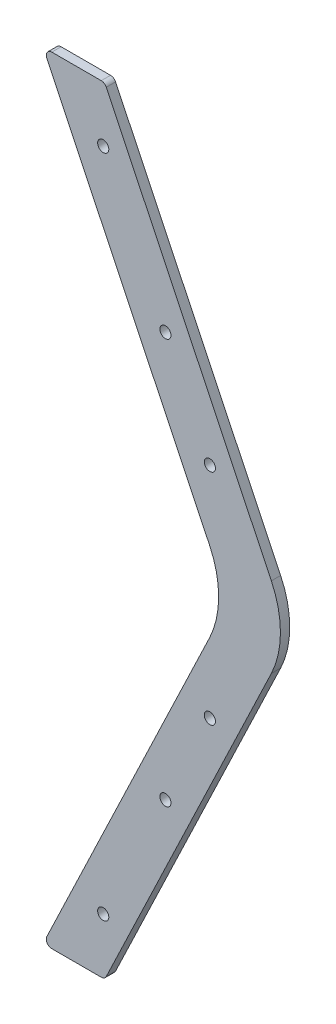
ISO-10303-21;
HEADER;
FILE_DESCRIPTION(('STEP AP214'),'2;1');
FILE_NAME('part.step','',(''),(''),'','','');
FILE_SCHEMA(('AUTOMOTIVE_DESIGN { 1 0 10303 214 1 1 1 1 }'));
ENDSEC;
DATA;
#1=APPLICATION_CONTEXT('core data for automotive mechanical design processes');
#2=APPLICATION_PROTOCOL_DEFINITION('international standard','automotive_design',2000,#1);
#3=PRODUCT_CONTEXT('',#1,'mechanical');
#4=PRODUCT('Part','Part','',(#3));
#5=PRODUCT_RELATED_PRODUCT_CATEGORY('part','',(#4));
#6=PRODUCT_DEFINITION_FORMATION('','',#4);
#7=PRODUCT_DEFINITION_CONTEXT('part definition',#1,'design');
#8=PRODUCT_DEFINITION('design','',#6,#7);
#9=PRODUCT_DEFINITION_SHAPE('','',#8);
#10=(LENGTH_UNIT() NAMED_UNIT(*) SI_UNIT(.MILLI.,.METRE.));
#11=(NAMED_UNIT(*) PLANE_ANGLE_UNIT() SI_UNIT($,.RADIAN.));
#12=(NAMED_UNIT(*) SI_UNIT($,.STERADIAN.) SOLID_ANGLE_UNIT());
#13=UNCERTAINTY_MEASURE_WITH_UNIT(LENGTH_MEASURE(1.E-05),#10,'distance_accuracy_value','');
#14=(GEOMETRIC_REPRESENTATION_CONTEXT(3) GLOBAL_UNCERTAINTY_ASSIGNED_CONTEXT((#13)) GLOBAL_UNIT_ASSIGNED_CONTEXT((#10,
#11,#12)) REPRESENTATION_CONTEXT('',''));
#15=CARTESIAN_POINT('',(0.,0.,0.));
#16=DIRECTION('',(0.,0.,1.));
#17=DIRECTION('',(1.,0.,0.));
#18=AXIS2_PLACEMENT_3D('',#15,#16,#17);
#19=CARTESIAN_POINT('',(0.,-209.,5.));
#20=DIRECTION('',(0.,1.,0.));
#21=DIRECTION('',(-1.,0.,0.));
#22=AXIS2_PLACEMENT_3D('',#19,#20,#21);
#23=PLANE('',#22);
#24=DIRECTION('',(1.,0.,0.));
#25=VECTOR('',#24,1.);
#26=CARTESIAN_POINT('',(0.,-209.,0.));
#27=LINE('',#26,#25);
#28=CARTESIAN_POINT('',(4.76112352209064,-209.,0.));
#29=VERTEX_POINT('',#28);
#30=CARTESIAN_POINT('',(31.3668581102988,-209.,0.));
#31=VERTEX_POINT('',#30);
#32=EDGE_CURVE('E228',#29,#31,#27,.T.);
#33=ORIENTED_EDGE('',*,*,#32,.T.);
#34=DIRECTION('',(0.,0.,-1.));
#35=VECTOR('',#34,1.);
#36=CARTESIAN_POINT('',(31.3668581102988,-209.,5.));
#37=LINE('',#36,#35);
#38=CARTESIAN_POINT('',(31.3668581102988,-209.,5.));
#39=VERTEX_POINT('',#38);
#40=EDGE_CURVE('E189',#31,#39,#37,.F.);
#41=ORIENTED_EDGE('',*,*,#40,.T.);
#42=DIRECTION('',(1.,0.,0.));
#43=VECTOR('',#42,1.);
#44=CARTESIAN_POINT('',(0.,-209.,5.));
#45=LINE('',#44,#43);
#46=CARTESIAN_POINT('',(4.76112352209064,-209.,5.));
#47=VERTEX_POINT('',#46);
#48=EDGE_CURVE('E166',#47,#39,#45,.T.);
#49=ORIENTED_EDGE('',*,*,#48,.F.);
#50=DIRECTION('',(0.,0.,-1.));
#51=VECTOR('',#50,1.);
#52=CARTESIAN_POINT('',(4.76112352209064,-209.,5.));
#53=LINE('',#52,#51);
#54=EDGE_CURVE('E186',#47,#29,#53,.T.);
#55=ORIENTED_EDGE('',*,*,#54,.T.);
#56=EDGE_LOOP('',(#33,#41,#49,#55));
#57=FACE_BOUND('',#56,.T.);
#58=ADVANCED_FACE('F39',(#57),#23,.F.);
#59=CARTESIAN_POINT('',(133.25716823526,0.,5.));
#60=DIRECTION('',(-0.902061167318299,0.431608214027894,0.));
#61=DIRECTION('',(-0.431608214027894,-0.902061167318299,0.));
#62=AXIS2_PLACEMENT_3D('',#59,#60,#61);
#63=PLANE('',#62);
#64=DIRECTION('',(0.431608214027894,0.902061167318299,0.));
#65=VECTOR('',#64,1.);
#66=CARTESIAN_POINT('',(133.25716823526,0.,0.));
#67=LINE('',#66,#65);
#68=CARTESIAN_POINT('',(34.0730416122537,-207.294824642084,0.));
#69=VERTEX_POINT('',#68);
#70=CARTESIAN_POINT('',(122.931612875741,-21.5804107013947,0.));
#71=VERTEX_POINT('',#70);
#72=EDGE_CURVE('E161',#69,#71,#67,.T.);
#73=ORIENTED_EDGE('',*,*,#72,.T.);
#74=DIRECTION('',(0.,0.,-1.));
#75=VECTOR('',#74,1.);
#76=CARTESIAN_POINT('',(122.931612875741,-21.5804107013947,5.));
#77=LINE('',#76,#75);
#78=CARTESIAN_POINT('',(122.931612875741,-21.5804107013947,5.));
#79=VERTEX_POINT('',#78);
#80=EDGE_CURVE('E202',#71,#79,#77,.F.);
#81=ORIENTED_EDGE('',*,*,#80,.T.);
#82=DIRECTION('',(0.431608214027894,0.902061167318299,0.));
#83=VECTOR('',#82,1.);
#84=CARTESIAN_POINT('',(133.25716823526,0.,5.));
#85=LINE('',#84,#83);
#86=CARTESIAN_POINT('',(34.0730416122537,-207.294824642084,5.));
#87=VERTEX_POINT('',#86);
#88=EDGE_CURVE('E244',#87,#79,#85,.T.);
#89=ORIENTED_EDGE('',*,*,#88,.F.);
#90=DIRECTION('',(0.,0.,-1.));
#91=VECTOR('',#90,1.);
#92=CARTESIAN_POINT('',(34.0730416122537,-207.294824642084,5.));
#93=LINE('',#92,#91);
#94=EDGE_CURVE('E183',#87,#69,#93,.T.);
#95=ORIENTED_EDGE('',*,*,#94,.T.);
#96=EDGE_LOOP('',(#73,#81,#89,#95));
#97=FACE_BOUND('',#96,.T.);
#98=ADVANCED_FACE('F296',(#97),#63,.F.);
#99=CARTESIAN_POINT('',(33.2571682352602,209.,5.));
#100=DIRECTION('',(-0.902061167318298,-0.431608214027895,0.));
#101=DIRECTION('',(0.431608214027895,-0.902061167318298,0.));
#102=AXIS2_PLACEMENT_3D('',#99,#100,#101);
#103=PLANE('',#102);
#104=DIRECTION('',(-0.431608214027895,0.902061167318298,0.));
#105=VECTOR('',#104,1.);
#106=CARTESIAN_POINT('',(33.2571682352602,209.,5.));
#107=LINE('',#106,#105);
#108=CARTESIAN_POINT('',(122.931612875741,21.5804107013948,5.));
#109=VERTEX_POINT('',#108);
#110=CARTESIAN_POINT('',(34.0730416122537,207.294824642084,5.));
#111=VERTEX_POINT('',#110);
#112=EDGE_CURVE('E242',#109,#111,#107,.T.);
#113=ORIENTED_EDGE('',*,*,#112,.F.);
#114=DIRECTION('',(0.,0.,-1.));
#115=VECTOR('',#114,1.);
#116=CARTESIAN_POINT('',(122.931612875741,21.5804107013947,5.));
#117=LINE('',#116,#115);
#118=CARTESIAN_POINT('',(122.931612875741,21.5804107013948,0.));
#119=VERTEX_POINT('',#118);
#120=EDGE_CURVE('E197',#109,#119,#117,.T.);
#121=ORIENTED_EDGE('',*,*,#120,.T.);
#122=DIRECTION('',(-0.431608214027895,0.902061167318298,0.));
#123=VECTOR('',#122,1.);
#124=CARTESIAN_POINT('',(33.2571682352602,209.,0.));
#125=LINE('',#124,#123);
#126=CARTESIAN_POINT('',(34.0730416122537,207.294824642084,0.));
#127=VERTEX_POINT('',#126);
#128=EDGE_CURVE('E157',#119,#127,#125,.T.);
#129=ORIENTED_EDGE('',*,*,#128,.T.);
#130=DIRECTION('',(0.,0.,-1.));
#131=VECTOR('',#130,1.);
#132=CARTESIAN_POINT('',(34.0730416122537,207.294824642084,5.));
#133=LINE('',#132,#131);
#134=EDGE_CURVE('E137',#127,#111,#133,.F.);
#135=ORIENTED_EDGE('',*,*,#134,.T.);
#136=EDGE_LOOP('',(#113,#121,#129,#135));
#137=FACE_BOUND('',#136,.T.);
#138=ADVANCED_FACE('F294',(#137),#103,.F.);
#139=CARTESIAN_POINT('',(0.,209.,5.));
#140=DIRECTION('',(0.,-1.,0.));
#141=DIRECTION('',(1.,0.,0.));
#142=AXIS2_PLACEMENT_3D('',#139,#140,#141);
#143=PLANE('',#142);
#144=DIRECTION('',(-1.,0.,0.));
#145=VECTOR('',#144,1.);
#146=CARTESIAN_POINT('',(0.,209.,5.));
#147=LINE('',#146,#145);
#148=CARTESIAN_POINT('',(31.3668581102988,209.,5.));
#149=VERTEX_POINT('',#148);
#150=CARTESIAN_POINT('',(4.76112352209056,209.,5.));
#151=VERTEX_POINT('',#150);
#152=EDGE_CURVE('E150',#149,#151,#147,.T.);
#153=ORIENTED_EDGE('',*,*,#152,.F.);
#154=DIRECTION('',(0.,0.,-1.));
#155=VECTOR('',#154,1.);
#156=CARTESIAN_POINT('',(31.3668581102988,209.,5.));
#157=LINE('',#156,#155);
#158=CARTESIAN_POINT('',(31.3668581102988,209.,0.));
#159=VERTEX_POINT('',#158);
#160=EDGE_CURVE('E135',#149,#159,#157,.T.);
#161=ORIENTED_EDGE('',*,*,#160,.T.);
#162=DIRECTION('',(-1.,0.,0.));
#163=VECTOR('',#162,1.);
#164=CARTESIAN_POINT('',(0.,209.,0.));
#165=LINE('',#164,#163);
#166=CARTESIAN_POINT('',(4.76112352209056,209.,0.));
#167=VERTEX_POINT('',#166);
#168=EDGE_CURVE('E147',#159,#167,#165,.T.);
#169=ORIENTED_EDGE('',*,*,#168,.T.);
#170=DIRECTION('',(0.,0.,-1.));
#171=VECTOR('',#170,1.);
#172=CARTESIAN_POINT('',(4.76112352209056,209.,5.));
#173=LINE('',#172,#171);
#174=EDGE_CURVE('E152',#167,#151,#173,.F.);
#175=ORIENTED_EDGE('',*,*,#174,.T.);
#176=EDGE_LOOP('',(#153,#161,#169,#175));
#177=FACE_BOUND('',#176,.T.);
#178=ADVANCED_FACE('F146',(#177),#143,.F.);
#179=CARTESIAN_POINT('',(0.,209.,5.));
#180=DIRECTION('',(0.902061167318298,0.431608214027894,0.));
#181=DIRECTION('',(-0.431608214027894,0.902061167318298,0.));
#182=AXIS2_PLACEMENT_3D('',#179,#180,#181);
#183=PLANE('',#182);
#184=DIRECTION('',(0.431608214027894,-0.902061167318298,0.));
#185=VECTOR('',#184,1.);
#186=CARTESIAN_POINT('',(0.,209.,0.));
#187=LINE('',#186,#185);
#188=CARTESIAN_POINT('',(2.05494002013566,204.705175357916,0.));
#189=VERTEX_POINT('',#188);
#190=CARTESIAN_POINT('',(89.674444640481,21.5804107013948,0.));
#191=VERTEX_POINT('',#190);
#192=EDGE_CURVE('E156',#189,#191,#187,.T.);
#193=ORIENTED_EDGE('',*,*,#192,.T.);
#194=DIRECTION('',(0.,0.,-1.));
#195=VECTOR('',#194,1.);
#196=CARTESIAN_POINT('',(89.674444640481,21.5804107013947,5.));
#197=LINE('',#196,#195);
#198=CARTESIAN_POINT('',(89.674444640481,21.5804107013948,5.));
#199=VERTEX_POINT('',#198);
#200=EDGE_CURVE('E62',#191,#199,#197,.F.);
#201=ORIENTED_EDGE('',*,*,#200,.T.);
#202=DIRECTION('',(0.431608214027894,-0.902061167318298,0.));
#203=VECTOR('',#202,1.);
#204=CARTESIAN_POINT('',(0.,209.,5.));
#205=LINE('',#204,#203);
#206=CARTESIAN_POINT('',(2.05494002013566,204.705175357916,5.));
#207=VERTEX_POINT('',#206);
#208=EDGE_CURVE('E239',#207,#199,#205,.T.);
#209=ORIENTED_EDGE('',*,*,#208,.F.);
#210=DIRECTION('',(0.,0.,-1.));
#211=VECTOR('',#210,1.);
#212=CARTESIAN_POINT('',(2.05494002013566,204.705175357916,5.));
#213=LINE('',#212,#211);
#214=EDGE_CURVE('E194',#207,#189,#213,.T.);
#215=ORIENTED_EDGE('',*,*,#214,.T.);
#216=EDGE_LOOP('',(#193,#201,#209,#215));
#217=FACE_BOUND('',#216,.T.);
#218=ADVANCED_FACE('F308',(#217),#183,.F.);
#219=CARTESIAN_POINT('',(100.,0.,5.));
#220=DIRECTION('',(0.902061167318299,-0.431608214027894,0.));
#221=DIRECTION('',(0.431608214027894,0.902061167318299,0.));
#222=AXIS2_PLACEMENT_3D('',#219,#220,#221);
#223=PLANE('',#222);
#224=DIRECTION('',(-0.431608214027894,-0.902061167318299,0.));
#225=VECTOR('',#224,1.);
#226=CARTESIAN_POINT('',(100.,0.,5.));
#227=LINE('',#226,#225);
#228=CARTESIAN_POINT('',(89.674444640481,-21.5804107013947,5.));
#229=VERTEX_POINT('',#228);
#230=CARTESIAN_POINT('',(2.05494002013573,-204.705175357916,5.));
#231=VERTEX_POINT('',#230);
#232=EDGE_CURVE('E167',#229,#231,#227,.T.);
#233=ORIENTED_EDGE('',*,*,#232,.F.);
#234=DIRECTION('',(0.,0.,-1.));
#235=VECTOR('',#234,1.);
#236=CARTESIAN_POINT('',(89.674444640481,-21.5804107013947,0.));
#237=LINE('',#236,#235);
#238=CARTESIAN_POINT('',(89.674444640481,-21.5804107013947,0.));
#239=VERTEX_POINT('',#238);
#240=EDGE_CURVE('E206',#229,#239,#237,.T.);
#241=ORIENTED_EDGE('',*,*,#240,.T.);
#242=DIRECTION('',(-0.431608214027894,-0.902061167318299,0.));
#243=VECTOR('',#242,1.);
#244=CARTESIAN_POINT('',(100.,0.,0.));
#245=LINE('',#244,#243);
#246=CARTESIAN_POINT('',(2.05494002013573,-204.705175357916,0.));
#247=VERTEX_POINT('',#246);
#248=EDGE_CURVE('E159',#239,#247,#245,.T.);
#249=ORIENTED_EDGE('',*,*,#248,.T.);
#250=DIRECTION('',(0.,0.,-1.));
#251=VECTOR('',#250,1.);
#252=CARTESIAN_POINT('',(2.05494002013573,-204.705175357916,5.));
#253=LINE('',#252,#251);
#254=EDGE_CURVE('E191',#247,#231,#253,.F.);
#255=ORIENTED_EDGE('',*,*,#254,.T.);
#256=EDGE_LOOP('',(#233,#241,#249,#255));
#257=FACE_BOUND('',#256,.T.);
#258=ADVANCED_FACE('F272',(#257),#223,.F.);
#259=CARTESIAN_POINT('',(0.,0.,5.));
#260=DIRECTION('',(0.,0.,-1.));
#261=DIRECTION('',(-1.,0.,0.));
#262=AXIS2_PLACEMENT_3D('',#259,#260,#261);
#263=PLANE('',#262);
#264=CARTESIAN_POINT('',(32.4180578018406,179.,5.));
#265=DIRECTION('',(0.,0.,1.));
#266=DIRECTION('',(1.,0.,0.));
#267=AXIS2_PLACEMENT_3D('',#264,#265,#266);
#268=CIRCLE('',#267,3.);
#269=CARTESIAN_POINT('',(35.4180578018406,179.,5.));
#270=VERTEX_POINT('',#269);
#271=EDGE_CURVE('E215',#270,#270,#268,.T.);
#272=ORIENTED_EDGE('',*,*,#271,.F.);
#273=EDGE_LOOP('',(#272));
#274=FACE_BOUND('',#273,.T.);
#275=CARTESIAN_POINT('',(65.9108807683478,109.,5.));
#276=DIRECTION('',(0.,0.,1.));
#277=DIRECTION('',(1.,0.,0.));
#278=AXIS2_PLACEMENT_3D('',#275,#276,#277);
#279=CIRCLE('',#278,3.00000000000001);
#280=CARTESIAN_POINT('',(68.9108807683478,109.,5.));
#281=VERTEX_POINT('',#280);
#282=EDGE_CURVE('E261',#281,#281,#279,.T.);
#283=ORIENTED_EDGE('',*,*,#282,.F.);
#284=EDGE_LOOP('',(#283));
#285=FACE_BOUND('',#284,.T.);
#286=CARTESIAN_POINT('',(89.8343257444244,59.,5.));
#287=DIRECTION('',(0.,0.,1.));
#288=DIRECTION('',(1.,0.,0.));
#289=AXIS2_PLACEMENT_3D('',#286,#287,#288);
#290=CIRCLE('',#289,3.00000000000001);
#291=CARTESIAN_POINT('',(92.8343257444244,59.,5.));
#292=VERTEX_POINT('',#291);
#293=EDGE_CURVE('E258',#292,#292,#290,.T.);
#294=ORIENTED_EDGE('',*,*,#293,.F.);
#295=EDGE_LOOP('',(#294));
#296=FACE_BOUND('',#295,.T.);
#297=CARTESIAN_POINT('',(89.8343257444245,-59.,5.));
#298=DIRECTION('',(0.,0.,1.));
#299=DIRECTION('',(1.,0.,0.));
#300=AXIS2_PLACEMENT_3D('',#297,#298,#299);
#301=CIRCLE('',#300,3.00000000000001);
#302=CARTESIAN_POINT('',(92.8343257444245,-59.,5.));
#303=VERTEX_POINT('',#302);
#304=EDGE_CURVE('E255',#303,#303,#301,.T.);
#305=ORIENTED_EDGE('',*,*,#304,.F.);
#306=EDGE_LOOP('',(#305));
#307=FACE_BOUND('',#306,.T.);
#308=CARTESIAN_POINT('',(65.9108807683479,-109.,5.));
#309=DIRECTION('',(0.,0.,1.));
#310=DIRECTION('',(1.,0.,0.));
#311=AXIS2_PLACEMENT_3D('',#308,#309,#310);
#312=CIRCLE('',#311,3.00000000000002);
#313=CARTESIAN_POINT('',(68.9108807683479,-109.,5.));
#314=VERTEX_POINT('',#313);
#315=EDGE_CURVE('E252',#314,#314,#312,.T.);
#316=ORIENTED_EDGE('',*,*,#315,.F.);
#317=EDGE_LOOP('',(#316));
#318=FACE_BOUND('',#317,.T.);
#319=CARTESIAN_POINT('',(32.4180578018407,-179.,5.));
#320=DIRECTION('',(0.,0.,1.));
#321=DIRECTION('',(1.,0.,0.));
#322=AXIS2_PLACEMENT_3D('',#319,#320,#321);
#323=CIRCLE('',#322,2.99999999999999);
#324=CARTESIAN_POINT('',(35.4180578018407,-179.,5.));
#325=VERTEX_POINT('',#324);
#326=EDGE_CURVE('E249',#325,#325,#323,.T.);
#327=ORIENTED_EDGE('',*,*,#326,.F.);
#328=EDGE_LOOP('',(#327));
#329=FACE_BOUND('',#328,.T.);
#330=ORIENTED_EDGE('',*,*,#88,.T.);
#331=CARTESIAN_POINT('',(77.8285545098264,0.,5.));
#332=DIRECTION('',(0.,0.,-1.));
#333=DIRECTION('',(-1.,0.,0.));
#334=AXIS2_PLACEMENT_3D('',#331,#332,#333);
#335=CIRCLE('',#334,50.);
#336=EDGE_CURVE('E204',#79,#109,#335,.F.);
#337=ORIENTED_EDGE('',*,*,#336,.T.);
#338=ORIENTED_EDGE('',*,*,#112,.T.);
#339=CARTESIAN_POINT('',(31.3668581102988,206.,5.));
#340=DIRECTION('',(0.,0.,-1.));
#341=DIRECTION('',(-1.,0.,0.));
#342=AXIS2_PLACEMENT_3D('',#339,#340,#341);
#343=CIRCLE('',#342,3.);
#344=EDGE_CURVE('E181',#111,#149,#343,.F.);
#345=ORIENTED_EDGE('',*,*,#344,.T.);
#346=ORIENTED_EDGE('',*,*,#152,.T.);
#347=CARTESIAN_POINT('',(4.76112352209056,206.,5.));
#348=DIRECTION('',(0.,0.,-1.));
#349=DIRECTION('',(-1.,0.,0.));
#350=AXIS2_PLACEMENT_3D('',#347,#348,#349);
#351=CIRCLE('',#350,3.);
#352=EDGE_CURVE('E175',#151,#207,#351,.F.);
#353=ORIENTED_EDGE('',*,*,#352,.T.);
#354=ORIENTED_EDGE('',*,*,#208,.T.);
#355=CARTESIAN_POINT('',(44.5713862745661,0.,5.));
#356=DIRECTION('',(0.,0.,-1.));
#357=DIRECTION('',(-1.,0.,0.));
#358=AXIS2_PLACEMENT_3D('',#355,#356,#357);
#359=CIRCLE('',#358,50.);
#360=EDGE_CURVE('E11',#199,#229,#359,.T.);
#361=ORIENTED_EDGE('',*,*,#360,.T.);
#362=ORIENTED_EDGE('',*,*,#232,.T.);
#363=CARTESIAN_POINT('',(4.76112352209064,-206.,5.));
#364=DIRECTION('',(0.,0.,-1.));
#365=DIRECTION('',(-1.,0.,0.));
#366=AXIS2_PLACEMENT_3D('',#363,#364,#365);
#367=CIRCLE('',#366,3.);
#368=EDGE_CURVE('E177',#231,#47,#367,.F.);
#369=ORIENTED_EDGE('',*,*,#368,.T.);
#370=ORIENTED_EDGE('',*,*,#48,.T.);
#371=CARTESIAN_POINT('',(31.3668581102988,-206.,5.));
#372=DIRECTION('',(0.,0.,-1.));
#373=DIRECTION('',(-1.,0.,0.));
#374=AXIS2_PLACEMENT_3D('',#371,#372,#373);
#375=CIRCLE('',#374,3.);
#376=EDGE_CURVE('E179',#39,#87,#375,.F.);
#377=ORIENTED_EDGE('',*,*,#376,.T.);
#378=EDGE_LOOP('',(#330,#337,#338,#345,#346,#353,#354,#361,#362,#369,#370,#377));
#379=FACE_BOUND('',#378,.T.);
#380=ADVANCED_FACE('F269',(#274,#285,#296,#307,#318,#329,#379),#263,.F.);
#381=CARTESIAN_POINT('',(0.,0.,0.));
#382=DIRECTION('',(0.,0.,-1.));
#383=DIRECTION('',(-1.,0.,0.));
#384=AXIS2_PLACEMENT_3D('',#381,#382,#383);
#385=PLANE('',#384);
#386=CARTESIAN_POINT('',(32.4180578018406,179.,0.));
#387=DIRECTION('',(0.,0.,-1.));
#388=DIRECTION('',(-1.,0.,0.));
#389=AXIS2_PLACEMENT_3D('',#386,#387,#388);
#390=CIRCLE('',#389,3.);
#391=CARTESIAN_POINT('',(29.4180578018406,179.,0.));
#392=VERTEX_POINT('',#391);
#393=EDGE_CURVE('E43',#392,#392,#390,.T.);
#394=ORIENTED_EDGE('',*,*,#393,.F.);
#395=EDGE_LOOP('',(#394));
#396=FACE_BOUND('',#395,.T.);
#397=CARTESIAN_POINT('',(65.9108807683478,109.,0.));
#398=DIRECTION('',(0.,0.,-1.));
#399=DIRECTION('',(-1.,0.,0.));
#400=AXIS2_PLACEMENT_3D('',#397,#398,#399);
#401=CIRCLE('',#400,3.00000000000001);
#402=CARTESIAN_POINT('',(62.9108807683478,109.,0.));
#403=VERTEX_POINT('',#402);
#404=EDGE_CURVE('E223',#403,#403,#401,.T.);
#405=ORIENTED_EDGE('',*,*,#404,.F.);
#406=EDGE_LOOP('',(#405));
#407=FACE_BOUND('',#406,.T.);
#408=CARTESIAN_POINT('',(89.8343257444244,59.,0.));
#409=DIRECTION('',(0.,0.,-1.));
#410=DIRECTION('',(-1.,0.,0.));
#411=AXIS2_PLACEMENT_3D('',#408,#409,#410);
#412=CIRCLE('',#411,3.00000000000001);
#413=CARTESIAN_POINT('',(86.8343257444244,59.,0.));
#414=VERTEX_POINT('',#413);
#415=EDGE_CURVE('E221',#414,#414,#412,.T.);
#416=ORIENTED_EDGE('',*,*,#415,.F.);
#417=EDGE_LOOP('',(#416));
#418=FACE_BOUND('',#417,.T.);
#419=CARTESIAN_POINT('',(89.8343257444245,-59.,0.));
#420=DIRECTION('',(0.,0.,-1.));
#421=DIRECTION('',(-1.,0.,0.));
#422=AXIS2_PLACEMENT_3D('',#419,#420,#421);
#423=CIRCLE('',#422,3.00000000000001);
#424=CARTESIAN_POINT('',(86.8343257444245,-59.,0.));
#425=VERTEX_POINT('',#424);
#426=EDGE_CURVE('E218',#425,#425,#423,.T.);
#427=ORIENTED_EDGE('',*,*,#426,.F.);
#428=EDGE_LOOP('',(#427));
#429=FACE_BOUND('',#428,.T.);
#430=CARTESIAN_POINT('',(65.9108807683479,-109.,0.));
#431=DIRECTION('',(0.,0.,-1.));
#432=DIRECTION('',(-1.,0.,0.));
#433=AXIS2_PLACEMENT_3D('',#430,#431,#432);
#434=CIRCLE('',#433,3.00000000000002);
#435=CARTESIAN_POINT('',(62.9108807683479,-109.,0.));
#436=VERTEX_POINT('',#435);
#437=EDGE_CURVE('E214',#436,#436,#434,.T.);
#438=ORIENTED_EDGE('',*,*,#437,.F.);
#439=EDGE_LOOP('',(#438));
#440=FACE_BOUND('',#439,.T.);
#441=CARTESIAN_POINT('',(32.4180578018407,-179.,0.));
#442=DIRECTION('',(0.,0.,-1.));
#443=DIRECTION('',(-1.,0.,0.));
#444=AXIS2_PLACEMENT_3D('',#441,#442,#443);
#445=CIRCLE('',#444,2.99999999999999);
#446=CARTESIAN_POINT('',(29.4180578018407,-179.,0.));
#447=VERTEX_POINT('',#446);
#448=EDGE_CURVE('E211',#447,#447,#445,.T.);
#449=ORIENTED_EDGE('',*,*,#448,.F.);
#450=EDGE_LOOP('',(#449));
#451=FACE_BOUND('',#450,.T.);
#452=ORIENTED_EDGE('',*,*,#128,.F.);
#453=CARTESIAN_POINT('',(77.8285545098264,0.,0.));
#454=DIRECTION('',(0.,0.,-1.));
#455=DIRECTION('',(-1.,0.,0.));
#456=AXIS2_PLACEMENT_3D('',#453,#454,#455);
#457=CIRCLE('',#456,50.);
#458=EDGE_CURVE('E200',#119,#71,#457,.T.);
#459=ORIENTED_EDGE('',*,*,#458,.T.);
#460=ORIENTED_EDGE('',*,*,#72,.F.);
#461=CARTESIAN_POINT('',(31.3668581102988,-206.,0.));
#462=DIRECTION('',(0.,0.,-1.));
#463=DIRECTION('',(-1.,0.,0.));
#464=AXIS2_PLACEMENT_3D('',#461,#462,#463);
#465=CIRCLE('',#464,3.);
#466=EDGE_CURVE('E141',#69,#31,#465,.T.);
#467=ORIENTED_EDGE('',*,*,#466,.T.);
#468=ORIENTED_EDGE('',*,*,#32,.F.);
#469=CARTESIAN_POINT('',(4.76112352209064,-206.,0.));
#470=DIRECTION('',(0.,0.,-1.));
#471=DIRECTION('',(-1.,0.,0.));
#472=AXIS2_PLACEMENT_3D('',#469,#470,#471);
#473=CIRCLE('',#472,3.);
#474=EDGE_CURVE('E170',#29,#247,#473,.T.);
#475=ORIENTED_EDGE('',*,*,#474,.T.);
#476=ORIENTED_EDGE('',*,*,#248,.F.);
#477=CARTESIAN_POINT('',(44.5713862745661,0.,0.));
#478=DIRECTION('',(0.,0.,-1.));
#479=DIRECTION('',(-1.,0.,0.));
#480=AXIS2_PLACEMENT_3D('',#477,#478,#479);
#481=CIRCLE('',#480,50.);
#482=EDGE_CURVE('E48',#239,#191,#481,.F.);
#483=ORIENTED_EDGE('',*,*,#482,.T.);
#484=ORIENTED_EDGE('',*,*,#192,.F.);
#485=CARTESIAN_POINT('',(4.76112352209056,206.,0.));
#486=DIRECTION('',(0.,0.,-1.));
#487=DIRECTION('',(-1.,0.,0.));
#488=AXIS2_PLACEMENT_3D('',#485,#486,#487);
#489=CIRCLE('',#488,3.);
#490=EDGE_CURVE('E151',#189,#167,#489,.T.);
#491=ORIENTED_EDGE('',*,*,#490,.T.);
#492=ORIENTED_EDGE('',*,*,#168,.F.);
#493=CARTESIAN_POINT('',(31.3668581102988,206.,0.));
#494=DIRECTION('',(0.,0.,-1.));
#495=DIRECTION('',(-1.,0.,0.));
#496=AXIS2_PLACEMENT_3D('',#493,#494,#495);
#497=CIRCLE('',#496,3.);
#498=EDGE_CURVE('E131',#159,#127,#497,.T.);
#499=ORIENTED_EDGE('',*,*,#498,.T.);
#500=EDGE_LOOP('',(#452,#459,#460,#467,#468,#475,#476,#483,#484,#491,#492,#499));
#501=FACE_BOUND('',#500,.T.);
#502=ADVANCED_FACE('F154',(#396,#407,#418,#429,#440,#451,#501),#385,.T.);
#503=CARTESIAN_POINT('',(31.3668581102988,206.,5.));
#504=DIRECTION('',(0.,0.,-1.));
#505=DIRECTION('',(-1.,0.,0.));
#506=AXIS2_PLACEMENT_3D('',#503,#504,#505);
#507=CYLINDRICAL_SURFACE('',#506,3.);
#508=ORIENTED_EDGE('',*,*,#344,.F.);
#509=ORIENTED_EDGE('',*,*,#134,.F.);
#510=ORIENTED_EDGE('',*,*,#498,.F.);
#511=ORIENTED_EDGE('',*,*,#160,.F.);
#512=EDGE_LOOP('',(#508,#509,#510,#511));
#513=FACE_BOUND('',#512,.T.);
#514=ADVANCED_FACE('F134',(#513),#507,.T.);
#515=CARTESIAN_POINT('',(31.3668581102988,-206.,5.));
#516=DIRECTION('',(0.,0.,-1.));
#517=DIRECTION('',(-1.,0.,0.));
#518=AXIS2_PLACEMENT_3D('',#515,#516,#517);
#519=CYLINDRICAL_SURFACE('',#518,3.);
#520=ORIENTED_EDGE('',*,*,#376,.F.);
#521=ORIENTED_EDGE('',*,*,#40,.F.);
#522=ORIENTED_EDGE('',*,*,#466,.F.);
#523=ORIENTED_EDGE('',*,*,#94,.F.);
#524=EDGE_LOOP('',(#520,#521,#522,#523));
#525=FACE_BOUND('',#524,.T.);
#526=ADVANCED_FACE('F298',(#525),#519,.T.);
#527=CARTESIAN_POINT('',(4.76112352209064,-206.,5.));
#528=DIRECTION('',(0.,0.,-1.));
#529=DIRECTION('',(-1.,0.,0.));
#530=AXIS2_PLACEMENT_3D('',#527,#528,#529);
#531=CYLINDRICAL_SURFACE('',#530,3.);
#532=ORIENTED_EDGE('',*,*,#368,.F.);
#533=ORIENTED_EDGE('',*,*,#254,.F.);
#534=ORIENTED_EDGE('',*,*,#474,.F.);
#535=ORIENTED_EDGE('',*,*,#54,.F.);
#536=EDGE_LOOP('',(#532,#533,#534,#535));
#537=FACE_BOUND('',#536,.T.);
#538=ADVANCED_FACE('F304',(#537),#531,.T.);
#539=CARTESIAN_POINT('',(4.76112352209056,206.,5.));
#540=DIRECTION('',(0.,0.,-1.));
#541=DIRECTION('',(-1.,0.,0.));
#542=AXIS2_PLACEMENT_3D('',#539,#540,#541);
#543=CYLINDRICAL_SURFACE('',#542,3.);
#544=ORIENTED_EDGE('',*,*,#352,.F.);
#545=ORIENTED_EDGE('',*,*,#174,.F.);
#546=ORIENTED_EDGE('',*,*,#490,.F.);
#547=ORIENTED_EDGE('',*,*,#214,.F.);
#548=EDGE_LOOP('',(#544,#545,#546,#547));
#549=FACE_BOUND('',#548,.T.);
#550=ADVANCED_FACE('F312',(#549),#543,.T.);
#551=CARTESIAN_POINT('',(77.8285545098264,0.,5.));
#552=DIRECTION('',(0.,0.,-1.));
#553=DIRECTION('',(-1.,0.,0.));
#554=AXIS2_PLACEMENT_3D('',#551,#552,#553);
#555=CYLINDRICAL_SURFACE('',#554,50.);
#556=ORIENTED_EDGE('',*,*,#336,.F.);
#557=ORIENTED_EDGE('',*,*,#80,.F.);
#558=ORIENTED_EDGE('',*,*,#458,.F.);
#559=ORIENTED_EDGE('',*,*,#120,.F.);
#560=EDGE_LOOP('',(#556,#557,#558,#559));
#561=FACE_BOUND('',#560,.T.);
#562=ADVANCED_FACE('F292',(#561),#555,.T.);
#563=CARTESIAN_POINT('',(44.5713862745661,0.,5.));
#564=DIRECTION('',(0.,0.,1.));
#565=DIRECTION('',(1.,0.,0.));
#566=AXIS2_PLACEMENT_3D('',#563,#564,#565);
#567=CYLINDRICAL_SURFACE('',#566,50.);
#568=ORIENTED_EDGE('',*,*,#360,.F.);
#569=ORIENTED_EDGE('',*,*,#200,.F.);
#570=ORIENTED_EDGE('',*,*,#482,.F.);
#571=ORIENTED_EDGE('',*,*,#240,.F.);
#572=EDGE_LOOP('',(#568,#569,#570,#571));
#573=FACE_BOUND('',#572,.T.);
#574=ADVANCED_FACE('F41',(#573),#567,.F.);
#575=CARTESIAN_POINT('',(32.4180578018407,-179.,-5.));
#576=DIRECTION('',(0.,0.,1.));
#577=DIRECTION('',(1.,0.,0.));
#578=AXIS2_PLACEMENT_3D('',#575,#576,#577);
#579=CYLINDRICAL_SURFACE('',#578,2.99999999999999);
#580=ORIENTED_EDGE('',*,*,#448,.T.);
#581=EDGE_LOOP('',(#580));
#582=FACE_BOUND('',#581,.T.);
#583=ORIENTED_EDGE('',*,*,#326,.T.);
#584=EDGE_LOOP('',(#583));
#585=FACE_BOUND('',#584,.T.);
#586=ADVANCED_FACE('F399',(#582,#585),#579,.F.);
#587=CARTESIAN_POINT('',(65.9108807683479,-109.,-5.));
#588=DIRECTION('',(0.,0.,1.));
#589=DIRECTION('',(1.,0.,0.));
#590=AXIS2_PLACEMENT_3D('',#587,#588,#589);
#591=CYLINDRICAL_SURFACE('',#590,3.00000000000002);
#592=ORIENTED_EDGE('',*,*,#437,.T.);
#593=EDGE_LOOP('',(#592));
#594=FACE_BOUND('',#593,.T.);
#595=ORIENTED_EDGE('',*,*,#315,.T.);
#596=EDGE_LOOP('',(#595));
#597=FACE_BOUND('',#596,.T.);
#598=ADVANCED_FACE('F424',(#594,#597),#591,.F.);
#599=CARTESIAN_POINT('',(89.8343257444245,-59.,-5.));
#600=DIRECTION('',(0.,0.,1.));
#601=DIRECTION('',(1.,0.,0.));
#602=AXIS2_PLACEMENT_3D('',#599,#600,#601);
#603=CYLINDRICAL_SURFACE('',#602,3.00000000000001);
#604=ORIENTED_EDGE('',*,*,#426,.T.);
#605=EDGE_LOOP('',(#604));
#606=FACE_BOUND('',#605,.T.);
#607=ORIENTED_EDGE('',*,*,#304,.T.);
#608=EDGE_LOOP('',(#607));
#609=FACE_BOUND('',#608,.T.);
#610=ADVANCED_FACE('F435',(#606,#609),#603,.F.);
#611=CARTESIAN_POINT('',(89.8343257444244,59.,-5.));
#612=DIRECTION('',(0.,0.,1.));
#613=DIRECTION('',(1.,0.,0.));
#614=AXIS2_PLACEMENT_3D('',#611,#612,#613);
#615=CYLINDRICAL_SURFACE('',#614,3.00000000000001);
#616=ORIENTED_EDGE('',*,*,#415,.T.);
#617=EDGE_LOOP('',(#616));
#618=FACE_BOUND('',#617,.T.);
#619=ORIENTED_EDGE('',*,*,#293,.T.);
#620=EDGE_LOOP('',(#619));
#621=FACE_BOUND('',#620,.T.);
#622=ADVANCED_FACE('F446',(#618,#621),#615,.F.);
#623=CARTESIAN_POINT('',(65.9108807683478,109.,-5.));
#624=DIRECTION('',(0.,0.,1.));
#625=DIRECTION('',(1.,0.,0.));
#626=AXIS2_PLACEMENT_3D('',#623,#624,#625);
#627=CYLINDRICAL_SURFACE('',#626,3.00000000000001);
#628=ORIENTED_EDGE('',*,*,#404,.T.);
#629=EDGE_LOOP('',(#628));
#630=FACE_BOUND('',#629,.T.);
#631=ORIENTED_EDGE('',*,*,#282,.T.);
#632=EDGE_LOOP('',(#631));
#633=FACE_BOUND('',#632,.T.);
#634=ADVANCED_FACE('F457',(#630,#633),#627,.F.);
#635=CARTESIAN_POINT('',(32.4180578018406,179.,-5.));
#636=DIRECTION('',(0.,0.,1.));
#637=DIRECTION('',(1.,0.,0.));
#638=AXIS2_PLACEMENT_3D('',#635,#636,#637);
#639=CYLINDRICAL_SURFACE('',#638,3.);
#640=ORIENTED_EDGE('',*,*,#393,.T.);
#641=EDGE_LOOP('',(#640));
#642=FACE_BOUND('',#641,.T.);
#643=ORIENTED_EDGE('',*,*,#271,.T.);
#644=EDGE_LOOP('',(#643));
#645=FACE_BOUND('',#644,.T.);
#646=ADVANCED_FACE('F267',(#642,#645),#639,.F.);
#647=CLOSED_SHELL('',(#58,#98,#138,#178,#218,#258,#380,#502,#514,#526,#538,#550,#562,#574,#586,
#598,#610,#622,#634,#646));
#648=MANIFOLD_SOLID_BREP('B2',#647);
#649=ADVANCED_BREP_SHAPE_REPRESENTATION('',(#18,#648),#14);
#650=SHAPE_DEFINITION_REPRESENTATION(#9,#649);
ENDSEC;
END-ISO-10303-21;
